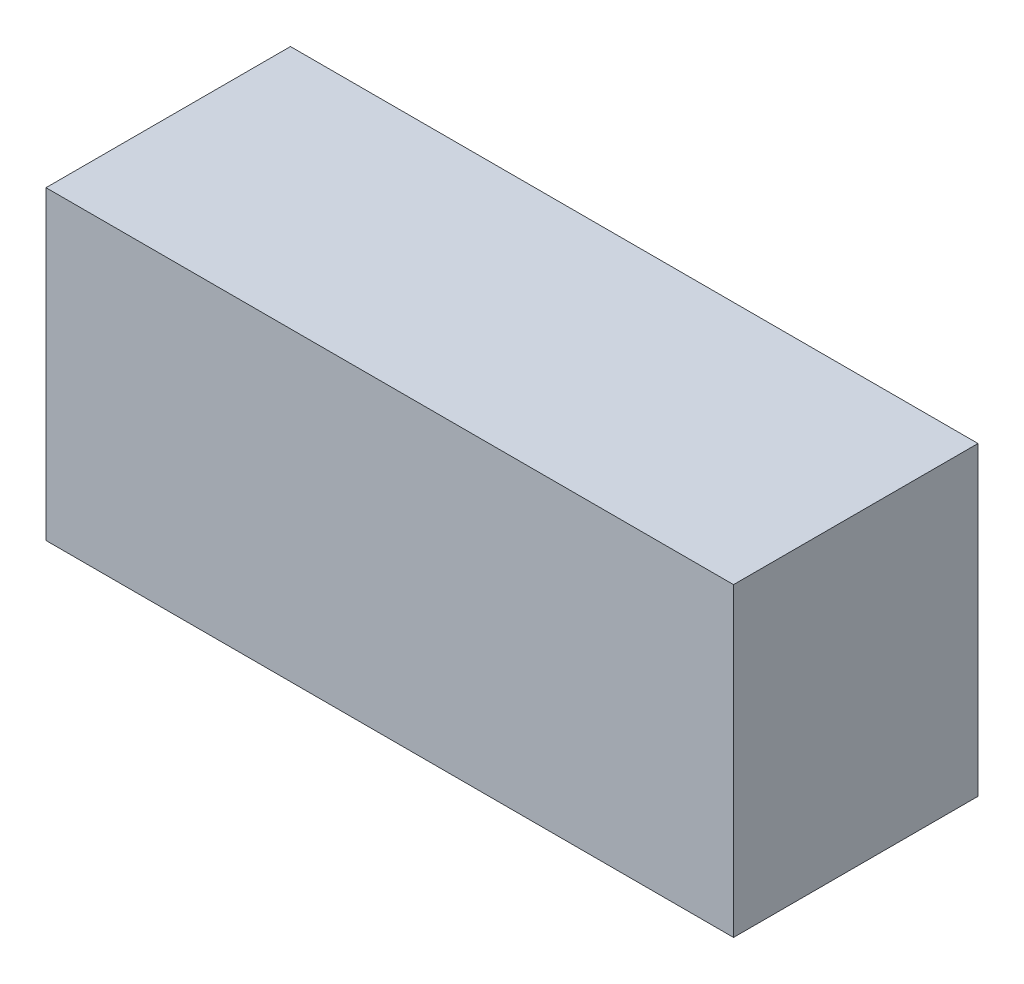
ISO-10303-21;
HEADER;
FILE_DESCRIPTION(('STEP AP214'),'2;1');
FILE_NAME('part.step','',(''),(''),'','','');
FILE_SCHEMA(('AUTOMOTIVE_DESIGN { 1 0 10303 214 1 1 1 1 }'));
ENDSEC;
DATA;
#1=APPLICATION_CONTEXT('core data for automotive mechanical design processes');
#2=APPLICATION_PROTOCOL_DEFINITION('international standard','automotive_design',2000,#1);
#3=PRODUCT_CONTEXT('',#1,'mechanical');
#4=PRODUCT('Part','Part','',(#3));
#5=PRODUCT_RELATED_PRODUCT_CATEGORY('part','',(#4));
#6=PRODUCT_DEFINITION_FORMATION('','',#4);
#7=PRODUCT_DEFINITION_CONTEXT('part definition',#1,'design');
#8=PRODUCT_DEFINITION('design','',#6,#7);
#9=PRODUCT_DEFINITION_SHAPE('','',#8);
#10=(LENGTH_UNIT() NAMED_UNIT(*) SI_UNIT(.MILLI.,.METRE.));
#11=(NAMED_UNIT(*) PLANE_ANGLE_UNIT() SI_UNIT($,.RADIAN.));
#12=(NAMED_UNIT(*) SI_UNIT($,.STERADIAN.) SOLID_ANGLE_UNIT());
#13=UNCERTAINTY_MEASURE_WITH_UNIT(LENGTH_MEASURE(1.E-05),#10,'distance_accuracy_value','');
#14=(GEOMETRIC_REPRESENTATION_CONTEXT(3) GLOBAL_UNCERTAINTY_ASSIGNED_CONTEXT((#13)) GLOBAL_UNIT_ASSIGNED_CONTEXT((#10,
#11,#12)) REPRESENTATION_CONTEXT('',''));
#15=CARTESIAN_POINT('',(0.,0.,0.));
#16=DIRECTION('',(0.,0.,1.));
#17=DIRECTION('',(1.,0.,0.));
#18=AXIS2_PLACEMENT_3D('',#15,#16,#17);
#19=CARTESIAN_POINT('',(22.5,20.,-8.));
#20=DIRECTION('',(-1.,0.,0.));
#21=DIRECTION('',(0.,0.,1.));
#22=AXIS2_PLACEMENT_3D('',#19,#20,#21);
#23=PLANE('',#22);
#24=DIRECTION('',(0.,0.,-1.));
#25=VECTOR('',#24,1.);
#26=CARTESIAN_POINT('',(22.5,0.,-8.));
#27=LINE('',#26,#25);
#28=CARTESIAN_POINT('',(22.5,0.,8.));
#29=VERTEX_POINT('',#28);
#30=CARTESIAN_POINT('',(22.5,0.,-8.));
#31=VERTEX_POINT('',#30);
#32=EDGE_CURVE('E96',#29,#31,#27,.T.);
#33=ORIENTED_EDGE('',*,*,#32,.T.);
#34=DIRECTION('',(0.,-1.,0.));
#35=VECTOR('',#34,1.);
#36=CARTESIAN_POINT('',(22.5,20.,-8.));
#37=LINE('',#36,#35);
#38=CARTESIAN_POINT('',(22.5,20.,-8.));
#39=VERTEX_POINT('',#38);
#40=EDGE_CURVE('E11',#39,#31,#37,.T.);
#41=ORIENTED_EDGE('',*,*,#40,.F.);
#42=DIRECTION('',(0.,0.,-1.));
#43=VECTOR('',#42,1.);
#44=CARTESIAN_POINT('',(22.5,20.,-8.));
#45=LINE('',#44,#43);
#46=CARTESIAN_POINT('',(22.5,20.,8.));
#47=VERTEX_POINT('',#46);
#48=EDGE_CURVE('E84',#47,#39,#45,.T.);
#49=ORIENTED_EDGE('',*,*,#48,.F.);
#50=DIRECTION('',(0.,-1.,0.));
#51=VECTOR('',#50,1.);
#52=CARTESIAN_POINT('',(22.5,20.,8.));
#53=LINE('',#52,#51);
#54=EDGE_CURVE('E92',#47,#29,#53,.T.);
#55=ORIENTED_EDGE('',*,*,#54,.T.);
#56=EDGE_LOOP('',(#33,#41,#49,#55));
#57=FACE_BOUND('',#56,.T.);
#58=ADVANCED_FACE('F33',(#57),#23,.F.);
#59=CARTESIAN_POINT('',(-22.5,20.,-8.));
#60=DIRECTION('',(0.,0.,1.));
#61=DIRECTION('',(1.,0.,0.));
#62=AXIS2_PLACEMENT_3D('',#59,#60,#61);
#63=PLANE('',#62);
#64=DIRECTION('',(-1.,0.,0.));
#65=VECTOR('',#64,1.);
#66=CARTESIAN_POINT('',(-22.5,0.,-8.));
#67=LINE('',#66,#65);
#68=CARTESIAN_POINT('',(-22.5,0.,-8.));
#69=VERTEX_POINT('',#68);
#70=EDGE_CURVE('E88',#31,#69,#67,.T.);
#71=ORIENTED_EDGE('',*,*,#70,.T.);
#72=DIRECTION('',(0.,-1.,0.));
#73=VECTOR('',#72,1.);
#74=CARTESIAN_POINT('',(-22.5,20.,-8.));
#75=LINE('',#74,#73);
#76=CARTESIAN_POINT('',(-22.5,20.,-8.));
#77=VERTEX_POINT('',#76);
#78=EDGE_CURVE('E41',#77,#69,#75,.T.);
#79=ORIENTED_EDGE('',*,*,#78,.F.);
#80=DIRECTION('',(-1.,0.,0.));
#81=VECTOR('',#80,1.);
#82=CARTESIAN_POINT('',(-22.5,20.,-8.));
#83=LINE('',#82,#81);
#84=EDGE_CURVE('E79',#39,#77,#83,.T.);
#85=ORIENTED_EDGE('',*,*,#84,.F.);
#86=ORIENTED_EDGE('',*,*,#40,.T.);
#87=EDGE_LOOP('',(#71,#79,#85,#86));
#88=FACE_BOUND('',#87,.T.);
#89=ADVANCED_FACE('F87',(#88),#63,.F.);
#90=CARTESIAN_POINT('',(-22.5,20.,-8.));
#91=DIRECTION('',(1.,0.,0.));
#92=DIRECTION('',(0.,0.,-1.));
#93=AXIS2_PLACEMENT_3D('',#90,#91,#92);
#94=PLANE('',#93);
#95=DIRECTION('',(0.,0.,1.));
#96=VECTOR('',#95,1.);
#97=CARTESIAN_POINT('',(-22.5,0.,-8.));
#98=LINE('',#97,#96);
#99=CARTESIAN_POINT('',(-22.5,0.,8.));
#100=VERTEX_POINT('',#99);
#101=EDGE_CURVE('E66',#69,#100,#98,.T.);
#102=ORIENTED_EDGE('',*,*,#101,.T.);
#103=DIRECTION('',(0.,-1.,0.));
#104=VECTOR('',#103,1.);
#105=CARTESIAN_POINT('',(-22.5,20.,8.));
#106=LINE('',#105,#104);
#107=CARTESIAN_POINT('',(-22.5,20.,8.));
#108=VERTEX_POINT('',#107);
#109=EDGE_CURVE('E89',#108,#100,#106,.T.);
#110=ORIENTED_EDGE('',*,*,#109,.F.);
#111=DIRECTION('',(0.,0.,1.));
#112=VECTOR('',#111,1.);
#113=CARTESIAN_POINT('',(-22.5,20.,-8.));
#114=LINE('',#113,#112);
#115=EDGE_CURVE('E82',#77,#108,#114,.T.);
#116=ORIENTED_EDGE('',*,*,#115,.F.);
#117=ORIENTED_EDGE('',*,*,#78,.T.);
#118=EDGE_LOOP('',(#102,#110,#116,#117));
#119=FACE_BOUND('',#118,.T.);
#120=ADVANCED_FACE('F90',(#119),#94,.F.);
#121=CARTESIAN_POINT('',(-22.5,20.,8.));
#122=DIRECTION('',(0.,0.,-1.));
#123=DIRECTION('',(-1.,0.,0.));
#124=AXIS2_PLACEMENT_3D('',#121,#122,#123);
#125=PLANE('',#124);
#126=DIRECTION('',(1.,0.,0.));
#127=VECTOR('',#126,1.);
#128=CARTESIAN_POINT('',(-22.5,0.,8.));
#129=LINE('',#128,#127);
#130=EDGE_CURVE('E72',#100,#29,#129,.T.);
#131=ORIENTED_EDGE('',*,*,#130,.T.);
#132=ORIENTED_EDGE('',*,*,#54,.F.);
#133=DIRECTION('',(1.,0.,0.));
#134=VECTOR('',#133,1.);
#135=CARTESIAN_POINT('',(-22.5,20.,8.));
#136=LINE('',#135,#134);
#137=EDGE_CURVE('E49',#108,#47,#136,.T.);
#138=ORIENTED_EDGE('',*,*,#137,.F.);
#139=ORIENTED_EDGE('',*,*,#109,.T.);
#140=EDGE_LOOP('',(#131,#132,#138,#139));
#141=FACE_BOUND('',#140,.T.);
#142=ADVANCED_FACE('F103',(#141),#125,.F.);
#143=CARTESIAN_POINT('',(0.,20.,0.));
#144=DIRECTION('',(0.,1.,0.));
#145=DIRECTION('',(0.,0.,1.));
#146=AXIS2_PLACEMENT_3D('',#143,#144,#145);
#147=PLANE('',#146);
#148=ORIENTED_EDGE('',*,*,#48,.T.);
#149=ORIENTED_EDGE('',*,*,#84,.T.);
#150=ORIENTED_EDGE('',*,*,#115,.T.);
#151=ORIENTED_EDGE('',*,*,#137,.T.);
#152=EDGE_LOOP('',(#148,#149,#150,#151));
#153=FACE_BOUND('',#152,.T.);
#154=ADVANCED_FACE('F80',(#153),#147,.T.);
#155=CARTESIAN_POINT('',(0.,0.,0.));
#156=DIRECTION('',(0.,1.,0.));
#157=DIRECTION('',(0.,0.,1.));
#158=AXIS2_PLACEMENT_3D('',#155,#156,#157);
#159=PLANE('',#158);
#160=ORIENTED_EDGE('',*,*,#32,.F.);
#161=ORIENTED_EDGE('',*,*,#130,.F.);
#162=ORIENTED_EDGE('',*,*,#101,.F.);
#163=ORIENTED_EDGE('',*,*,#70,.F.);
#164=EDGE_LOOP('',(#160,#161,#162,#163));
#165=FACE_BOUND('',#164,.T.);
#166=ADVANCED_FACE('F106',(#165),#159,.F.);
#167=CLOSED_SHELL('',(#58,#89,#120,#142,#154,#166));
#168=MANIFOLD_SOLID_BREP('B2',#167);
#169=ADVANCED_BREP_SHAPE_REPRESENTATION('',(#18,#168),#14);
#170=SHAPE_DEFINITION_REPRESENTATION(#9,#169);
ENDSEC;
END-ISO-10303-21;
